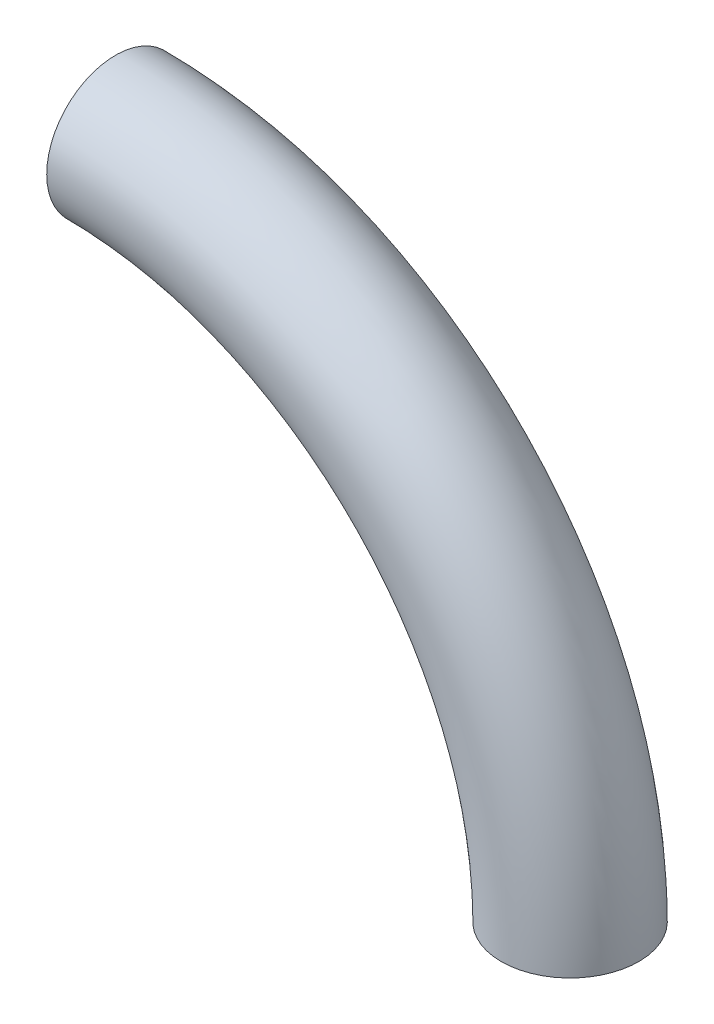
ISO-10303-21;
HEADER;
FILE_DESCRIPTION(('STEP AP214'),'2;1');
FILE_NAME('part.step','',(''),(''),'','','');
FILE_SCHEMA(('AUTOMOTIVE_DESIGN { 1 0 10303 214 1 1 1 1 }'));
ENDSEC;
DATA;
#1=APPLICATION_CONTEXT('core data for automotive mechanical design processes');
#2=APPLICATION_PROTOCOL_DEFINITION('international standard','automotive_design',2000,#1);
#3=PRODUCT_CONTEXT('',#1,'mechanical');
#4=PRODUCT('Part','Part','',(#3));
#5=PRODUCT_RELATED_PRODUCT_CATEGORY('part','',(#4));
#6=PRODUCT_DEFINITION_FORMATION('','',#4);
#7=PRODUCT_DEFINITION_CONTEXT('part definition',#1,'design');
#8=PRODUCT_DEFINITION('design','',#6,#7);
#9=PRODUCT_DEFINITION_SHAPE('','',#8);
#10=(LENGTH_UNIT() NAMED_UNIT(*) SI_UNIT(.MILLI.,.METRE.));
#11=(NAMED_UNIT(*) PLANE_ANGLE_UNIT() SI_UNIT($,.RADIAN.));
#12=(NAMED_UNIT(*) SI_UNIT($,.STERADIAN.) SOLID_ANGLE_UNIT());
#13=UNCERTAINTY_MEASURE_WITH_UNIT(LENGTH_MEASURE(1.E-05),#10,'distance_accuracy_value','');
#14=(GEOMETRIC_REPRESENTATION_CONTEXT(3) GLOBAL_UNCERTAINTY_ASSIGNED_CONTEXT((#13)) GLOBAL_UNIT_ASSIGNED_CONTEXT((#10,
#11,#12)) REPRESENTATION_CONTEXT('',''));
#15=CARTESIAN_POINT('',(0.,0.,0.));
#16=DIRECTION('',(0.,0.,1.));
#17=DIRECTION('',(1.,0.,0.));
#18=AXIS2_PLACEMENT_3D('',#15,#16,#17);
#19=CARTESIAN_POINT('',(0.,50.5708552698581,0.));
#20=DIRECTION('',(-1.,0.,0.));
#21=DIRECTION('',(0.,0.,1.));
#22=AXIS2_PLACEMENT_3D('',#19,#20,#21);
#23=PLANE('',#22);
#24=CARTESIAN_POINT('',(0.,50.5708552698581,0.));
#25=DIRECTION('',(-1.,0.,0.));
#26=DIRECTION('',(0.,0.,1.));
#27=AXIS2_PLACEMENT_3D('',#24,#25,#26);
#28=CIRCLE('',#27,7.65054180427913);
#29=CARTESIAN_POINT('',(0.,50.5708552698581,7.65054180427913));
#30=VERTEX_POINT('',#29);
#31=EDGE_CURVE('E40',#30,#30,#28,.T.);
#32=ORIENTED_EDGE('',*,*,#31,.T.);
#33=EDGE_LOOP('',(#32));
#34=FACE_BOUND('',#33,.T.);
#35=ADVANCED_FACE('F33',(#34),#23,.T.);
#36=CARTESIAN_POINT('',(50.5708552698581,0.,0.));
#37=DIRECTION('',(0.,1.,0.));
#38=DIRECTION('',(0.,0.,1.));
#39=AXIS2_PLACEMENT_3D('',#36,#37,#38);
#40=PLANE('',#39);
#41=CARTESIAN_POINT('',(50.5708552698581,0.,0.));
#42=DIRECTION('',(0.,1.,0.));
#43=DIRECTION('',(0.,0.,1.));
#44=AXIS2_PLACEMENT_3D('',#41,#42,#43);
#45=CIRCLE('',#44,7.65054180427913);
#46=CARTESIAN_POINT('',(50.5708552698581,0.,7.65054180427913));
#47=VERTEX_POINT('',#46);
#48=EDGE_CURVE('E11',#47,#47,#45,.T.);
#49=ORIENTED_EDGE('',*,*,#48,.F.);
#50=EDGE_LOOP('',(#49));
#51=FACE_BOUND('',#50,.T.);
#52=ADVANCED_FACE('F49',(#51),#40,.F.);
#53=CARTESIAN_POINT('',(0.,0.,0.));
#54=DIRECTION('',(0.,0.,-1.));
#55=DIRECTION('',(-1.,0.,0.));
#56=AXIS2_PLACEMENT_3D('',#53,#54,#55);
#57=TOROIDAL_SURFACE('',#56,50.5708552698581,7.65054180427913);
#58=ORIENTED_EDGE('',*,*,#48,.T.);
#59=EDGE_LOOP('',(#58));
#60=FACE_BOUND('',#59,.T.);
#61=ORIENTED_EDGE('',*,*,#31,.F.);
#62=EDGE_LOOP('',(#61));
#63=FACE_BOUND('',#62,.T.);
#64=ADVANCED_FACE('F47',(#60,#63),#57,.T.);
#65=CLOSED_SHELL('',(#35,#52,#64));
#66=MANIFOLD_SOLID_BREP('B2',#65);
#67=ADVANCED_BREP_SHAPE_REPRESENTATION('',(#18,#66),#14);
#68=SHAPE_DEFINITION_REPRESENTATION(#9,#67);
ENDSEC;
END-ISO-10303-21;
